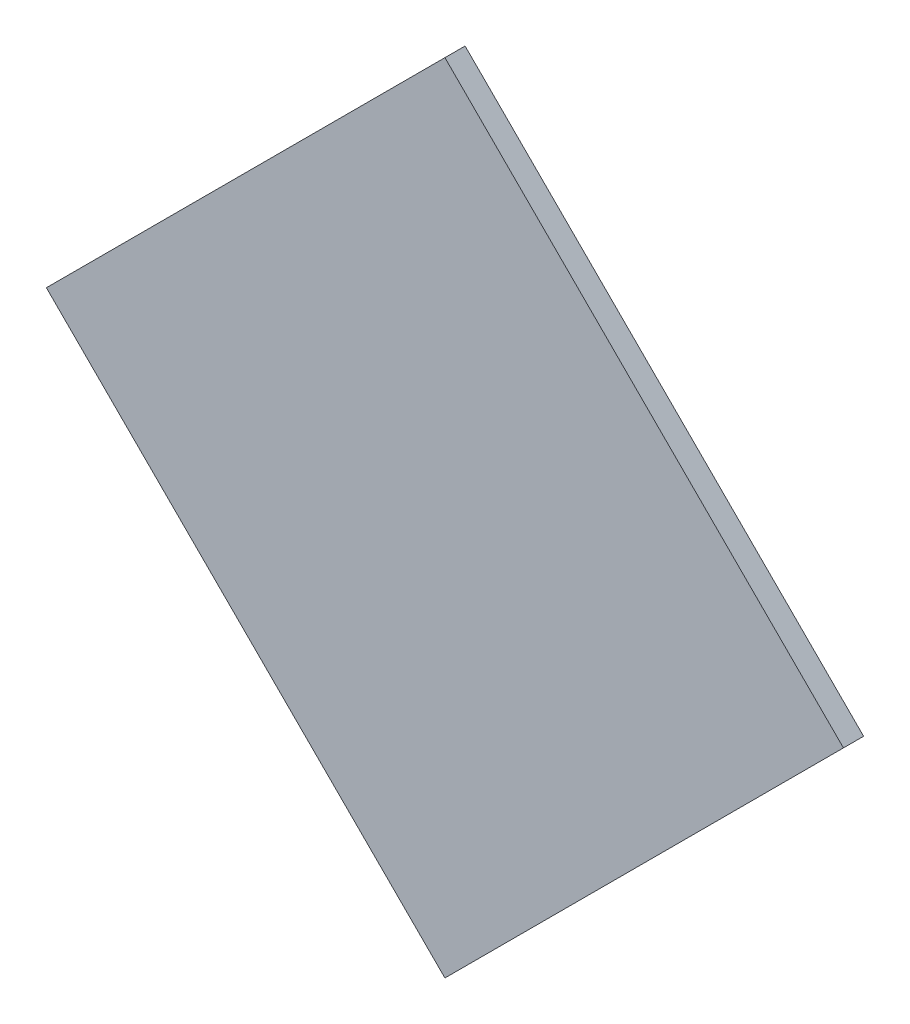
ISO-10303-21;
HEADER;
FILE_DESCRIPTION(('STEP AP214'),'2;1');
FILE_NAME('part.step','',(''),(''),'','','');
FILE_SCHEMA(('AUTOMOTIVE_DESIGN { 1 0 10303 214 1 1 1 1 }'));
ENDSEC;
DATA;
#1=APPLICATION_CONTEXT('core data for automotive mechanical design processes');
#2=APPLICATION_PROTOCOL_DEFINITION('international standard','automotive_design',2000,#1);
#3=PRODUCT_CONTEXT('',#1,'mechanical');
#4=PRODUCT('Part','Part','',(#3));
#5=PRODUCT_RELATED_PRODUCT_CATEGORY('part','',(#4));
#6=PRODUCT_DEFINITION_FORMATION('','',#4);
#7=PRODUCT_DEFINITION_CONTEXT('part definition',#1,'design');
#8=PRODUCT_DEFINITION('design','',#6,#7);
#9=PRODUCT_DEFINITION_SHAPE('','',#8);
#10=(LENGTH_UNIT() NAMED_UNIT(*) SI_UNIT(.MILLI.,.METRE.));
#11=(NAMED_UNIT(*) PLANE_ANGLE_UNIT() SI_UNIT($,.RADIAN.));
#12=(NAMED_UNIT(*) SI_UNIT($,.STERADIAN.) SOLID_ANGLE_UNIT());
#13=UNCERTAINTY_MEASURE_WITH_UNIT(LENGTH_MEASURE(1.E-05),#10,'distance_accuracy_value','');
#14=(GEOMETRIC_REPRESENTATION_CONTEXT(3) GLOBAL_UNCERTAINTY_ASSIGNED_CONTEXT((#13)) GLOBAL_UNIT_ASSIGNED_CONTEXT((#10,
#11,#12)) REPRESENTATION_CONTEXT('',''));
#15=CARTESIAN_POINT('',(0.,0.,0.));
#16=DIRECTION('',(0.,0.,1.));
#17=DIRECTION('',(1.,0.,0.));
#18=AXIS2_PLACEMENT_3D('',#15,#16,#17);
#19=CARTESIAN_POINT('',(-7.54113758784191,1.24349705579757,2.32971594000001));
#20=CARTESIAN_POINT('',(-7.54113758784191,1.24349705579757,2.02491594000001));
#21=CARTESIAN_POINT('',(-13.5673810598419,-4.78274641620242,2.32971594000001));
#22=CARTESIAN_POINT('',(-13.5673810598419,-4.78274641620242,2.02491594000001));
#23=(BOUNDED_SURFACE() B_SPLINE_SURFACE(1,1,((#19,#20),(#21,#22)),.UNSPECIFIED.,.F.,.F.,
.F.) B_SPLINE_SURFACE_WITH_KNOTS((2,2),(2,2),(-0.000710199604022059,0.00781219564424265),
(-0.0002794,2.54E-05),
.UNSPECIFIED.) GEOMETRIC_REPRESENTATION_ITEM() RATIONAL_B_SPLINE_SURFACE(((1.,1.),(1.,1.))) REPRESENTATION_ITEM('') SURFACE());
#24=CARTESIAN_POINT('',(-13.0651941038419,-4.28055946020242,2.05031594000001));
#25=CARTESIAN_POINT('',(-8.04332454384191,0.741310099797567,2.05031594000001));
#26=(BOUNDED_CURVE() B_SPLINE_CURVE(1,(#24,#25),.UNSPECIFIED.,.F.,
.F.) B_SPLINE_CURVE_WITH_KNOTS((2,2),(0.,0.00710199604022058),
.UNSPECIFIED.) CURVE() GEOMETRIC_REPRESENTATION_ITEM() RATIONAL_B_SPLINE_CURVE((1.,1.)) REPRESENTATION_ITEM(''));
#27=CARTESIAN_POINT('',(-13.0651941038419,-4.28055946020242,2.05031594000001));
#28=VERTEX_POINT('',#27);
#29=CARTESIAN_POINT('',(-8.04332454384193,0.741310099797582,2.05031594000001));
#30=VERTEX_POINT('',#29);
#31=EDGE_CURVE('E63',#28,#30,#26,.T.);
#32=CARTESIAN_POINT('',(-8.04332454384193,0.741310099797582,2.05031594000001));
#33=CARTESIAN_POINT('',(-8.04332454384193,0.741310099797582,2.30431594000001));
#34=(BOUNDED_CURVE() B_SPLINE_CURVE(1,(#32,#33),.UNSPECIFIED.,.F.,
.F.) B_SPLINE_CURVE_WITH_KNOTS((2,2),(0.,0.000254),
.UNSPECIFIED.) CURVE() GEOMETRIC_REPRESENTATION_ITEM() RATIONAL_B_SPLINE_CURVE((1.,1.)) REPRESENTATION_ITEM(''));
#35=CARTESIAN_POINT('',(-8.04332454384193,0.741310099797582,2.30431594000001));
#36=VERTEX_POINT('',#35);
#37=EDGE_CURVE('E11',#30,#36,#34,.T.);
#38=CARTESIAN_POINT('',(-13.0651941038419,-4.28055946020242,2.30431594000001));
#39=CARTESIAN_POINT('',(-8.04332454384191,0.741310099797567,2.30431594000001));
#40=(BOUNDED_CURVE() B_SPLINE_CURVE(1,(#38,#39),.UNSPECIFIED.,.F.,
.F.) B_SPLINE_CURVE_WITH_KNOTS((2,2),(0.,0.00710199604022058),
.UNSPECIFIED.) CURVE() GEOMETRIC_REPRESENTATION_ITEM() RATIONAL_B_SPLINE_CURVE((1.,1.)) REPRESENTATION_ITEM(''));
#41=CARTESIAN_POINT('',(-13.0651941038419,-4.28055946020242,2.30431594000001));
#42=VERTEX_POINT('',#41);
#43=EDGE_CURVE('E61',#42,#36,#40,.T.);
#44=CARTESIAN_POINT('',(-13.0651941038419,-4.28055946020242,2.05031594000001));
#45=CARTESIAN_POINT('',(-13.0651941038419,-4.28055946020242,2.30431594000001));
#46=(BOUNDED_CURVE() B_SPLINE_CURVE(1,(#44,#45),.UNSPECIFIED.,.F.,
.F.) B_SPLINE_CURVE_WITH_KNOTS((2,2),(0.,0.000254),
.UNSPECIFIED.) CURVE() GEOMETRIC_REPRESENTATION_ITEM() RATIONAL_B_SPLINE_CURVE((1.,1.)) REPRESENTATION_ITEM(''));
#47=EDGE_CURVE('E95',#28,#42,#46,.T.);
#48=ORIENTED_EDGE('',*,*,#31,.T.);
#49=ORIENTED_EDGE('',*,*,#37,.T.);
#50=ORIENTED_EDGE('',*,*,#43,.F.);
#51=ORIENTED_EDGE('',*,*,#47,.F.);
#52=EDGE_LOOP('',(#48,#49,#50,#51));
#53=FACE_BOUND('',#52,.T.);
#54=ADVANCED_FACE('F17',(#53),#23,.T.);
#55=CARTESIAN_POINT('',(-13.5673810598419,6.26536661579757,2.32971594000001));
#56=CARTESIAN_POINT('',(-13.5673810598419,6.26536661579757,2.02491594000001));
#57=CARTESIAN_POINT('',(-7.54113758784193,0.239123143797583,2.32971594000001));
#58=CARTESIAN_POINT('',(-7.54113758784193,0.239123143797583,2.02491594000001));
#59=(BOUNDED_SURFACE() B_SPLINE_SURFACE(1,1,((#55,#56),(#57,#58)),.UNSPECIFIED.,.F.,.F.,
.F.) B_SPLINE_SURFACE_WITH_KNOTS((2,2),(2,2),(-0.000710199604022059,0.00781219564424265),
(-0.0002794,2.54E-05),
.UNSPECIFIED.) GEOMETRIC_REPRESENTATION_ITEM() RATIONAL_B_SPLINE_SURFACE(((1.,1.),(1.,1.))) REPRESENTATION_ITEM('') SURFACE());
#60=CARTESIAN_POINT('',(-8.04332454384193,0.741310099797582,2.05031594000001));
#61=CARTESIAN_POINT('',(-13.0651941038419,5.76317965979757,2.05031594000001));
#62=(BOUNDED_CURVE() B_SPLINE_CURVE(1,(#60,#61),.UNSPECIFIED.,.F.,
.F.) B_SPLINE_CURVE_WITH_KNOTS((2,2),(0.,0.00710199604022059),
.UNSPECIFIED.) CURVE() GEOMETRIC_REPRESENTATION_ITEM() RATIONAL_B_SPLINE_CURVE((1.,1.)) REPRESENTATION_ITEM(''));
#63=CARTESIAN_POINT('',(-13.0651941038419,5.76317965979759,2.05031594000001));
#64=VERTEX_POINT('',#63);
#65=EDGE_CURVE('E85',#30,#64,#62,.T.);
#66=CARTESIAN_POINT('',(-13.0651941038419,5.76317965979759,2.05031594000001));
#67=CARTESIAN_POINT('',(-13.0651941038419,5.76317965979759,2.30431594000001));
#68=(BOUNDED_CURVE() B_SPLINE_CURVE(1,(#66,#67),.UNSPECIFIED.,.F.,
.F.) B_SPLINE_CURVE_WITH_KNOTS((2,2),(0.,0.000254),
.UNSPECIFIED.) CURVE() GEOMETRIC_REPRESENTATION_ITEM() RATIONAL_B_SPLINE_CURVE((1.,1.)) REPRESENTATION_ITEM(''));
#69=CARTESIAN_POINT('',(-13.0651941038419,5.76317965979759,2.30431594000001));
#70=VERTEX_POINT('',#69);
#71=EDGE_CURVE('E32',#64,#70,#68,.T.);
#72=CARTESIAN_POINT('',(-8.04332454384193,0.741310099797582,2.30431594000001));
#73=CARTESIAN_POINT('',(-13.0651941038419,5.76317965979757,2.30431594000001));
#74=(BOUNDED_CURVE() B_SPLINE_CURVE(1,(#72,#73),.UNSPECIFIED.,.F.,
.F.) B_SPLINE_CURVE_WITH_KNOTS((2,2),(0.,0.00710199604022059),
.UNSPECIFIED.) CURVE() GEOMETRIC_REPRESENTATION_ITEM() RATIONAL_B_SPLINE_CURVE((1.,1.)) REPRESENTATION_ITEM(''));
#75=EDGE_CURVE('E66',#36,#70,#74,.T.);
#76=ORIENTED_EDGE('',*,*,#65,.T.);
#77=ORIENTED_EDGE('',*,*,#71,.T.);
#78=ORIENTED_EDGE('',*,*,#75,.F.);
#79=ORIENTED_EDGE('',*,*,#37,.F.);
#80=EDGE_LOOP('',(#76,#77,#78,#79));
#81=FACE_BOUND('',#80,.T.);
#82=ADVANCED_FACE('F67',(#81),#59,.T.);
#83=CARTESIAN_POINT('',(-18.589250619842,0.239123143797531,2.32971594000001));
#84=CARTESIAN_POINT('',(-18.589250619842,0.239123143797531,2.02491594000001));
#85=CARTESIAN_POINT('',(-12.5630071478419,6.2653666157976,2.32971594000001));
#86=CARTESIAN_POINT('',(-12.5630071478419,6.2653666157976,2.02491594000001));
#87=(BOUNDED_SURFACE() B_SPLINE_SURFACE(1,1,((#83,#84),(#85,#86)),.UNSPECIFIED.,.F.,.F.,
.F.) B_SPLINE_SURFACE_WITH_KNOTS((2,2),(2,2),(-0.000710199604022068,0.00781219564424275),
(-0.0002794,2.54E-05),
.UNSPECIFIED.) GEOMETRIC_REPRESENTATION_ITEM() RATIONAL_B_SPLINE_SURFACE(((1.,1.),(1.,1.))) REPRESENTATION_ITEM('') SURFACE());
#88=CARTESIAN_POINT('',(-13.0651941038419,5.76317965979759,2.05031594000001));
#89=CARTESIAN_POINT('',(-18.087063663842,0.741310099797536,2.05031594000001));
#90=(BOUNDED_CURVE() B_SPLINE_CURVE(1,(#88,#89),.UNSPECIFIED.,.F.,
.F.) B_SPLINE_CURVE_WITH_KNOTS((2,2),(0.,0.00710199604022068),
.UNSPECIFIED.) CURVE() GEOMETRIC_REPRESENTATION_ITEM() RATIONAL_B_SPLINE_CURVE((1.,1.)) REPRESENTATION_ITEM(''));
#91=CARTESIAN_POINT('',(-18.087063663842,0.741310099797582,2.05031594000001));
#92=VERTEX_POINT('',#91);
#93=EDGE_CURVE('E23',#64,#92,#90,.T.);
#94=CARTESIAN_POINT('',(-18.087063663842,0.741310099797582,2.05031594000001));
#95=CARTESIAN_POINT('',(-18.087063663842,0.741310099797582,2.30431594000001));
#96=(BOUNDED_CURVE() B_SPLINE_CURVE(1,(#94,#95),.UNSPECIFIED.,.F.,
.F.) B_SPLINE_CURVE_WITH_KNOTS((2,2),(0.,0.000254),
.UNSPECIFIED.) CURVE() GEOMETRIC_REPRESENTATION_ITEM() RATIONAL_B_SPLINE_CURVE((1.,1.)) REPRESENTATION_ITEM(''));
#97=CARTESIAN_POINT('',(-18.087063663842,0.741310099797582,2.30431594000001));
#98=VERTEX_POINT('',#97);
#99=EDGE_CURVE('E88',#92,#98,#96,.T.);
#100=CARTESIAN_POINT('',(-13.0651941038419,5.76317965979759,2.30431594000001));
#101=CARTESIAN_POINT('',(-18.087063663842,0.741310099797536,2.30431594000001));
#102=(BOUNDED_CURVE() B_SPLINE_CURVE(1,(#100,#101),.UNSPECIFIED.,.F.,
.F.) B_SPLINE_CURVE_WITH_KNOTS((2,2),(0.,0.00710199604022068),
.UNSPECIFIED.) CURVE() GEOMETRIC_REPRESENTATION_ITEM() RATIONAL_B_SPLINE_CURVE((1.,1.)) REPRESENTATION_ITEM(''));
#103=EDGE_CURVE('E71',#70,#98,#102,.T.);
#104=ORIENTED_EDGE('',*,*,#93,.T.);
#105=ORIENTED_EDGE('',*,*,#99,.T.);
#106=ORIENTED_EDGE('',*,*,#103,.F.);
#107=ORIENTED_EDGE('',*,*,#71,.F.);
#108=EDGE_LOOP('',(#104,#105,#106,#107));
#109=FACE_BOUND('',#108,.T.);
#110=ADVANCED_FACE('F19',(#109),#87,.T.);
#111=CARTESIAN_POINT('',(-12.5630071478419,-4.78274641620248,2.32971594000001));
#112=CARTESIAN_POINT('',(-12.5630071478419,-4.78274641620248,2.02491594000001));
#113=CARTESIAN_POINT('',(-18.589250619842,1.24349705579759,2.32971594000001));
#114=CARTESIAN_POINT('',(-18.589250619842,1.24349705579759,2.02491594000001));
#115=(BOUNDED_SURFACE() B_SPLINE_SURFACE(1,1,((#111,#112),(#113,#114)),.UNSPECIFIED.,.F.,.F.,
.F.) B_SPLINE_SURFACE_WITH_KNOTS((2,2),(2,2),(-0.000710199604022068,0.00781219564424275),
(-0.0002794,2.54E-05),
.UNSPECIFIED.) GEOMETRIC_REPRESENTATION_ITEM() RATIONAL_B_SPLINE_SURFACE(((1.,1.),(1.,1.))) REPRESENTATION_ITEM('') SURFACE());
#116=CARTESIAN_POINT('',(-18.087063663842,0.741310099797582,2.05031594000001));
#117=CARTESIAN_POINT('',(-13.0651941038419,-4.28055946020247,2.05031594000001));
#118=(BOUNDED_CURVE() B_SPLINE_CURVE(1,(#116,#117),.UNSPECIFIED.,.F.,
.F.) B_SPLINE_CURVE_WITH_KNOTS((2,2),(0.,0.00710199604022067),
.UNSPECIFIED.) CURVE() GEOMETRIC_REPRESENTATION_ITEM() RATIONAL_B_SPLINE_CURVE((1.,1.)) REPRESENTATION_ITEM(''));
#119=EDGE_CURVE('E119',#92,#28,#118,.T.);
#120=CARTESIAN_POINT('',(-18.087063663842,0.741310099797582,2.30431594000001));
#121=CARTESIAN_POINT('',(-13.0651941038419,-4.28055946020247,2.30431594000001));
#122=(BOUNDED_CURVE() B_SPLINE_CURVE(1,(#120,#121),.UNSPECIFIED.,.F.,
.F.) B_SPLINE_CURVE_WITH_KNOTS((2,2),(0.,0.00710199604022067),
.UNSPECIFIED.) CURVE() GEOMETRIC_REPRESENTATION_ITEM() RATIONAL_B_SPLINE_CURVE((1.,1.)) REPRESENTATION_ITEM(''));
#123=EDGE_CURVE('E76',#98,#42,#122,.T.);
#124=ORIENTED_EDGE('',*,*,#119,.T.);
#125=ORIENTED_EDGE('',*,*,#47,.T.);
#126=ORIENTED_EDGE('',*,*,#123,.F.);
#127=ORIENTED_EDGE('',*,*,#99,.F.);
#128=EDGE_LOOP('',(#124,#125,#126,#127));
#129=FACE_BOUND('',#128,.T.);
#130=ADVANCED_FACE('F170',(#129),#115,.T.);
#131=CARTESIAN_POINT('',(-7.04332454384191,-5.28055946020247,2.05031594000001));
#132=CARTESIAN_POINT('',(-7.04332454384191,6.76317965979759,2.05031594000001));
#133=CARTESIAN_POINT('',(-19.087063663842,-5.28055946020247,2.05031594000001));
#134=CARTESIAN_POINT('',(-19.087063663842,6.76317965979759,2.05031594000001));
#135=(BOUNDED_SURFACE() B_SPLINE_SURFACE(1,1,((#131,#132),(#133,#134)),.UNSPECIFIED.,.F.,.F.,
.F.) B_SPLINE_SURFACE_WITH_KNOTS((2,2),(2,2),(-0.00602186955999999,0.0060218695600001),
(-0.00100000000000005,0.01104373912),
.UNSPECIFIED.) GEOMETRIC_REPRESENTATION_ITEM() RATIONAL_B_SPLINE_SURFACE(((1.,1.),(1.,1.))) REPRESENTATION_ITEM('') SURFACE());
#136=ORIENTED_EDGE('',*,*,#119,.F.);
#137=ORIENTED_EDGE('',*,*,#93,.F.);
#138=ORIENTED_EDGE('',*,*,#65,.F.);
#139=ORIENTED_EDGE('',*,*,#31,.F.);
#140=EDGE_LOOP('',(#136,#137,#138,#139));
#141=FACE_BOUND('',#140,.T.);
#142=ADVANCED_FACE('F168',(#141),#135,.T.);
#143=CARTESIAN_POINT('',(-19.087063663842,-5.28055946020247,2.30431594000001));
#144=CARTESIAN_POINT('',(-19.087063663842,6.76317965979759,2.30431594000001));
#145=CARTESIAN_POINT('',(-7.04332454384191,-5.28055946020247,2.30431594000001));
#146=CARTESIAN_POINT('',(-7.04332454384191,6.76317965979759,2.30431594000001));
#147=(BOUNDED_SURFACE() B_SPLINE_SURFACE(1,1,((#143,#144),(#145,#146)),.UNSPECIFIED.,.F.,.F.,
.F.) B_SPLINE_SURFACE_WITH_KNOTS((2,2),(2,2),(-0.00602186955999999,0.0060218695600001),
(-0.00100000000000005,0.01104373912),
.UNSPECIFIED.) GEOMETRIC_REPRESENTATION_ITEM() RATIONAL_B_SPLINE_SURFACE(((1.,1.),(1.,1.))) REPRESENTATION_ITEM('') SURFACE());
#148=ORIENTED_EDGE('',*,*,#43,.T.);
#149=ORIENTED_EDGE('',*,*,#75,.T.);
#150=ORIENTED_EDGE('',*,*,#103,.T.);
#151=ORIENTED_EDGE('',*,*,#123,.T.);
#152=EDGE_LOOP('',(#148,#149,#150,#151));
#153=FACE_BOUND('',#152,.T.);
#154=ADVANCED_FACE('F74',(#153),#147,.T.);
#155=CLOSED_SHELL('',(#54,#82,#110,#130,#142,#154));
#156=MANIFOLD_SOLID_BREP('B1',#155);
#157=ADVANCED_BREP_SHAPE_REPRESENTATION('',(#18,#156),#14);
#158=SHAPE_DEFINITION_REPRESENTATION(#9,#157);
ENDSEC;
END-ISO-10303-21;
